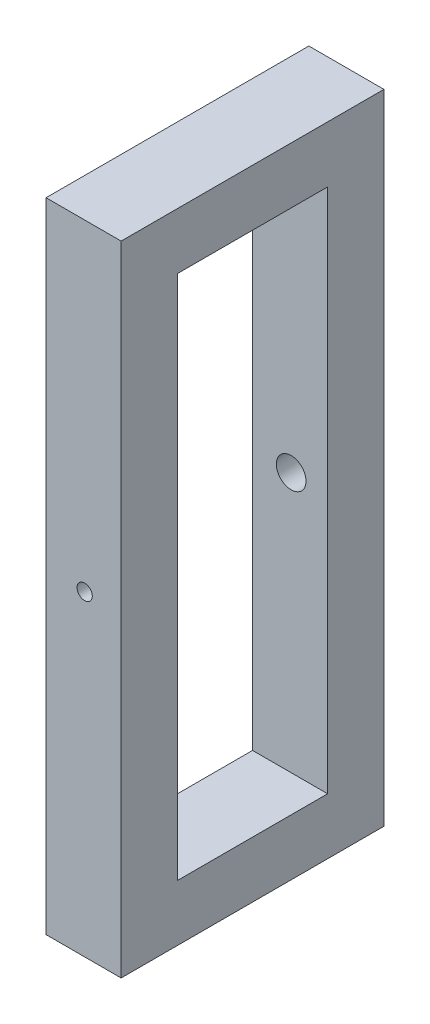
ISO-10303-21;
HEADER;
FILE_DESCRIPTION(('STEP AP214'),'2;1');
FILE_NAME('part.step','',(''),(''),'','','');
FILE_SCHEMA(('AUTOMOTIVE_DESIGN { 1 0 10303 214 1 1 1 1 }'));
ENDSEC;
DATA;
#1=APPLICATION_CONTEXT('core data for automotive mechanical design processes');
#2=APPLICATION_PROTOCOL_DEFINITION('international standard','automotive_design',2000,#1);
#3=PRODUCT_CONTEXT('',#1,'mechanical');
#4=PRODUCT('Part','Part','',(#3));
#5=PRODUCT_RELATED_PRODUCT_CATEGORY('part','',(#4));
#6=PRODUCT_DEFINITION_FORMATION('','',#4);
#7=PRODUCT_DEFINITION_CONTEXT('part definition',#1,'design');
#8=PRODUCT_DEFINITION('design','',#6,#7);
#9=PRODUCT_DEFINITION_SHAPE('','',#8);
#10=(LENGTH_UNIT() NAMED_UNIT(*) SI_UNIT(.MILLI.,.METRE.));
#11=(NAMED_UNIT(*) PLANE_ANGLE_UNIT() SI_UNIT($,.RADIAN.));
#12=(NAMED_UNIT(*) SI_UNIT($,.STERADIAN.) SOLID_ANGLE_UNIT());
#13=UNCERTAINTY_MEASURE_WITH_UNIT(LENGTH_MEASURE(1.E-05),#10,'distance_accuracy_value','');
#14=(GEOMETRIC_REPRESENTATION_CONTEXT(3) GLOBAL_UNCERTAINTY_ASSIGNED_CONTEXT((#13)) GLOBAL_UNIT_ASSIGNED_CONTEXT((#10,
#11,#12)) REPRESENTATION_CONTEXT('',''));
#15=CARTESIAN_POINT('',(0.,0.,0.));
#16=DIRECTION('',(0.,0.,1.));
#17=DIRECTION('',(1.,0.,0.));
#18=AXIS2_PLACEMENT_3D('',#15,#16,#17);
#19=CARTESIAN_POINT('',(20.,0.,0.));
#20=DIRECTION('',(-1.,0.,0.));
#21=DIRECTION('',(0.,0.,1.));
#22=AXIS2_PLACEMENT_3D('',#19,#20,#21);
#23=PLANE('',#22);
#24=DIRECTION('',(0.,1.,0.));
#25=VECTOR('',#24,1.);
#26=CARTESIAN_POINT('',(20.,-85.,-35.));
#27=LINE('',#26,#25);
#28=CARTESIAN_POINT('',(20.,-85.,-35.));
#29=VERTEX_POINT('',#28);
#30=CARTESIAN_POINT('',(20.,85.,-35.));
#31=VERTEX_POINT('',#30);
#32=EDGE_CURVE('E142',#29,#31,#27,.T.);
#33=ORIENTED_EDGE('',*,*,#32,.T.);
#34=DIRECTION('',(0.,0.,1.));
#35=VECTOR('',#34,1.);
#36=CARTESIAN_POINT('',(20.,85.,35.));
#37=LINE('',#36,#35);
#38=CARTESIAN_POINT('',(20.,85.,35.));
#39=VERTEX_POINT('',#38);
#40=EDGE_CURVE('E145',#31,#39,#37,.T.);
#41=ORIENTED_EDGE('',*,*,#40,.T.);
#42=DIRECTION('',(0.,-1.,0.));
#43=VECTOR('',#42,1.);
#44=CARTESIAN_POINT('',(20.,-85.,35.));
#45=LINE('',#44,#43);
#46=CARTESIAN_POINT('',(20.,-85.,35.));
#47=VERTEX_POINT('',#46);
#48=EDGE_CURVE('E148',#39,#47,#45,.T.);
#49=ORIENTED_EDGE('',*,*,#48,.T.);
#50=DIRECTION('',(0.,0.,-1.));
#51=VECTOR('',#50,1.);
#52=CARTESIAN_POINT('',(20.,-85.,35.));
#53=LINE('',#52,#51);
#54=EDGE_CURVE('E150',#47,#29,#53,.T.);
#55=ORIENTED_EDGE('',*,*,#54,.T.);
#56=EDGE_LOOP('',(#33,#41,#49,#55));
#57=FACE_BOUND('',#56,.T.);
#58=DIRECTION('',(0.,1.,0.));
#59=VECTOR('',#58,1.);
#60=CARTESIAN_POINT('',(20.,-70.,-20.));
#61=LINE('',#60,#59);
#62=CARTESIAN_POINT('',(20.,-70.,-20.));
#63=VERTEX_POINT('',#62);
#64=CARTESIAN_POINT('',(20.,70.,-20.));
#65=VERTEX_POINT('',#64);
#66=EDGE_CURVE('E104',#63,#65,#61,.T.);
#67=ORIENTED_EDGE('',*,*,#66,.F.);
#68=DIRECTION('',(0.,0.,-1.));
#69=VECTOR('',#68,1.);
#70=CARTESIAN_POINT('',(20.,-70.,20.));
#71=LINE('',#70,#69);
#72=CARTESIAN_POINT('',(20.,-70.,20.));
#73=VERTEX_POINT('',#72);
#74=EDGE_CURVE('E126',#73,#63,#71,.T.);
#75=ORIENTED_EDGE('',*,*,#74,.F.);
#76=DIRECTION('',(0.,-1.,0.));
#77=VECTOR('',#76,1.);
#78=CARTESIAN_POINT('',(20.,-70.,20.));
#79=LINE('',#78,#77);
#80=CARTESIAN_POINT('',(20.,70.,20.));
#81=VERTEX_POINT('',#80);
#82=EDGE_CURVE('E124',#81,#73,#79,.T.);
#83=ORIENTED_EDGE('',*,*,#82,.F.);
#84=DIRECTION('',(0.,0.,1.));
#85=VECTOR('',#84,1.);
#86=CARTESIAN_POINT('',(20.,70.,20.));
#87=LINE('',#86,#85);
#88=EDGE_CURVE('E112',#65,#81,#87,.T.);
#89=ORIENTED_EDGE('',*,*,#88,.F.);
#90=EDGE_LOOP('',(#67,#75,#83,#89));
#91=FACE_BOUND('',#90,.T.);
#92=ADVANCED_FACE('F38',(#57,#91),#23,.F.);
#93=CARTESIAN_POINT('',(0.,0.,0.));
#94=DIRECTION('',(-1.,0.,0.));
#95=DIRECTION('',(0.,0.,1.));
#96=AXIS2_PLACEMENT_3D('',#93,#94,#95);
#97=PLANE('',#96);
#98=DIRECTION('',(0.,1.,0.));
#99=VECTOR('',#98,1.);
#100=CARTESIAN_POINT('',(0.,-85.,-35.));
#101=LINE('',#100,#99);
#102=CARTESIAN_POINT('',(0.,-85.,-35.));
#103=VERTEX_POINT('',#102);
#104=CARTESIAN_POINT('',(0.,85.,-35.));
#105=VERTEX_POINT('',#104);
#106=EDGE_CURVE('E120',#103,#105,#101,.T.);
#107=ORIENTED_EDGE('',*,*,#106,.F.);
#108=DIRECTION('',(0.,0.,-1.));
#109=VECTOR('',#108,1.);
#110=CARTESIAN_POINT('',(0.,-85.,35.));
#111=LINE('',#110,#109);
#112=CARTESIAN_POINT('',(0.,-85.,35.));
#113=VERTEX_POINT('',#112);
#114=EDGE_CURVE('E146',#113,#103,#111,.T.);
#115=ORIENTED_EDGE('',*,*,#114,.F.);
#116=DIRECTION('',(0.,-1.,0.));
#117=VECTOR('',#116,1.);
#118=CARTESIAN_POINT('',(0.,-85.,35.));
#119=LINE('',#118,#117);
#120=CARTESIAN_POINT('',(0.,85.,35.));
#121=VERTEX_POINT('',#120);
#122=EDGE_CURVE('E157',#121,#113,#119,.T.);
#123=ORIENTED_EDGE('',*,*,#122,.F.);
#124=DIRECTION('',(0.,0.,1.));
#125=VECTOR('',#124,1.);
#126=CARTESIAN_POINT('',(0.,85.,35.));
#127=LINE('',#126,#125);
#128=EDGE_CURVE('E155',#105,#121,#127,.T.);
#129=ORIENTED_EDGE('',*,*,#128,.F.);
#130=EDGE_LOOP('',(#107,#115,#123,#129));
#131=FACE_BOUND('',#130,.T.);
#132=DIRECTION('',(0.,0.,-1.));
#133=VECTOR('',#132,1.);
#134=CARTESIAN_POINT('',(0.,-70.,20.));
#135=LINE('',#134,#133);
#136=CARTESIAN_POINT('',(0.,-70.,20.));
#137=VERTEX_POINT('',#136);
#138=CARTESIAN_POINT('',(0.,-70.,-20.));
#139=VERTEX_POINT('',#138);
#140=EDGE_CURVE('E113',#137,#139,#135,.T.);
#141=ORIENTED_EDGE('',*,*,#140,.T.);
#142=DIRECTION('',(0.,1.,0.));
#143=VECTOR('',#142,1.);
#144=CARTESIAN_POINT('',(0.,-70.,-20.));
#145=LINE('',#144,#143);
#146=CARTESIAN_POINT('',(0.,70.,-20.));
#147=VERTEX_POINT('',#146);
#148=EDGE_CURVE('E62',#139,#147,#145,.T.);
#149=ORIENTED_EDGE('',*,*,#148,.T.);
#150=DIRECTION('',(0.,0.,1.));
#151=VECTOR('',#150,1.);
#152=CARTESIAN_POINT('',(0.,70.,20.));
#153=LINE('',#152,#151);
#154=CARTESIAN_POINT('',(0.,70.,20.));
#155=VERTEX_POINT('',#154);
#156=EDGE_CURVE('E119',#147,#155,#153,.T.);
#157=ORIENTED_EDGE('',*,*,#156,.T.);
#158=DIRECTION('',(0.,-1.,0.));
#159=VECTOR('',#158,1.);
#160=CARTESIAN_POINT('',(0.,-70.,20.));
#161=LINE('',#160,#159);
#162=EDGE_CURVE('E134',#155,#137,#161,.T.);
#163=ORIENTED_EDGE('',*,*,#162,.T.);
#164=EDGE_LOOP('',(#141,#149,#157,#163));
#165=FACE_BOUND('',#164,.T.);
#166=ADVANCED_FACE('F176',(#131,#165),#97,.T.);
#167=CARTESIAN_POINT('',(20.,-85.,-35.));
#168=DIRECTION('',(0.,0.,1.));
#169=DIRECTION('',(1.,0.,0.));
#170=AXIS2_PLACEMENT_3D('',#167,#168,#169);
#171=PLANE('',#170);
#172=CARTESIAN_POINT('',(10.287047221847,-0.78442691867181,-35.));
#173=DIRECTION('',(0.,0.,1.));
#174=DIRECTION('',(1.,0.,0.));
#175=AXIS2_PLACEMENT_3D('',#172,#173,#174);
#176=CIRCLE('',#175,4.47618845762379);
#177=CARTESIAN_POINT('',(14.7632356794708,-0.78442691867181,-35.));
#178=VERTEX_POINT('',#177);
#179=EDGE_CURVE('E132',#178,#178,#176,.T.);
#180=ORIENTED_EDGE('',*,*,#179,.T.);
#181=EDGE_LOOP('',(#180));
#182=FACE_BOUND('',#181,.T.);
#183=ORIENTED_EDGE('',*,*,#106,.T.);
#184=DIRECTION('',(-1.,0.,0.));
#185=VECTOR('',#184,1.);
#186=CARTESIAN_POINT('',(20.,85.,-35.));
#187=LINE('',#186,#185);
#188=EDGE_CURVE('E11',#31,#105,#187,.T.);
#189=ORIENTED_EDGE('',*,*,#188,.F.);
#190=ORIENTED_EDGE('',*,*,#32,.F.);
#191=DIRECTION('',(-1.,0.,0.));
#192=VECTOR('',#191,1.);
#193=CARTESIAN_POINT('',(20.,-85.,-35.));
#194=LINE('',#193,#192);
#195=EDGE_CURVE('E152',#29,#103,#194,.T.);
#196=ORIENTED_EDGE('',*,*,#195,.T.);
#197=EDGE_LOOP('',(#183,#189,#190,#196));
#198=FACE_BOUND('',#197,.T.);
#199=ADVANCED_FACE('F40',(#182,#198),#171,.F.);
#200=CARTESIAN_POINT('',(20.,85.,35.));
#201=DIRECTION('',(0.,-1.,0.));
#202=DIRECTION('',(0.,0.,-1.));
#203=AXIS2_PLACEMENT_3D('',#200,#201,#202);
#204=PLANE('',#203);
#205=ORIENTED_EDGE('',*,*,#128,.T.);
#206=DIRECTION('',(-1.,0.,0.));
#207=VECTOR('',#206,1.);
#208=CARTESIAN_POINT('',(20.,85.,35.));
#209=LINE('',#208,#207);
#210=EDGE_CURVE('E47',#39,#121,#209,.T.);
#211=ORIENTED_EDGE('',*,*,#210,.F.);
#212=ORIENTED_EDGE('',*,*,#40,.F.);
#213=ORIENTED_EDGE('',*,*,#188,.T.);
#214=EDGE_LOOP('',(#205,#211,#212,#213));
#215=FACE_BOUND('',#214,.T.);
#216=ADVANCED_FACE('F186',(#215),#204,.F.);
#217=CARTESIAN_POINT('',(20.,-85.,35.));
#218=DIRECTION('',(0.,0.,-1.));
#219=DIRECTION('',(-1.,0.,0.));
#220=AXIS2_PLACEMENT_3D('',#217,#218,#219);
#221=PLANE('',#220);
#222=CARTESIAN_POINT('',(10.287047221847,-0.78442691867181,35.));
#223=DIRECTION('',(0.,0.,-1.));
#224=DIRECTION('',(-1.,0.,0.));
#225=AXIS2_PLACEMENT_3D('',#222,#223,#224);
#226=CIRCLE('',#225,2.03173459320144);
#227=CARTESIAN_POINT('',(8.25531262864559,-0.78442691867181,35.));
#228=VERTEX_POINT('',#227);
#229=EDGE_CURVE('E223',#228,#228,#226,.T.);
#230=ORIENTED_EDGE('',*,*,#229,.T.);
#231=EDGE_LOOP('',(#230));
#232=FACE_BOUND('',#231,.T.);
#233=ORIENTED_EDGE('',*,*,#122,.T.);
#234=DIRECTION('',(-1.,0.,0.));
#235=VECTOR('',#234,1.);
#236=CARTESIAN_POINT('',(20.,-85.,35.));
#237=LINE('',#236,#235);
#238=EDGE_CURVE('E162',#47,#113,#237,.T.);
#239=ORIENTED_EDGE('',*,*,#238,.F.);
#240=ORIENTED_EDGE('',*,*,#48,.F.);
#241=ORIENTED_EDGE('',*,*,#210,.T.);
#242=EDGE_LOOP('',(#233,#239,#240,#241));
#243=FACE_BOUND('',#242,.T.);
#244=ADVANCED_FACE('F170',(#232,#243),#221,.F.);
#245=CARTESIAN_POINT('',(20.,-85.,35.));
#246=DIRECTION('',(0.,1.,0.));
#247=DIRECTION('',(0.,0.,1.));
#248=AXIS2_PLACEMENT_3D('',#245,#246,#247);
#249=PLANE('',#248);
#250=ORIENTED_EDGE('',*,*,#114,.T.);
#251=ORIENTED_EDGE('',*,*,#195,.F.);
#252=ORIENTED_EDGE('',*,*,#54,.F.);
#253=ORIENTED_EDGE('',*,*,#238,.T.);
#254=EDGE_LOOP('',(#250,#251,#252,#253));
#255=FACE_BOUND('',#254,.T.);
#256=ADVANCED_FACE('F180',(#255),#249,.F.);
#257=CARTESIAN_POINT('',(20.,-70.,-20.));
#258=DIRECTION('',(0.,0.,1.));
#259=DIRECTION('',(1.,0.,0.));
#260=AXIS2_PLACEMENT_3D('',#257,#258,#259);
#261=PLANE('',#260);
#262=CARTESIAN_POINT('',(10.287047221847,-0.78442691867181,-20.));
#263=DIRECTION('',(0.,0.,1.));
#264=DIRECTION('',(1.,0.,0.));
#265=AXIS2_PLACEMENT_3D('',#262,#263,#264);
#266=CIRCLE('',#265,3.95237691524757);
#267=CARTESIAN_POINT('',(14.2394241370946,-0.78442691867181,-20.));
#268=VERTEX_POINT('',#267);
#269=EDGE_CURVE('E218',#268,#268,#266,.T.);
#270=ORIENTED_EDGE('',*,*,#269,.F.);
#271=EDGE_LOOP('',(#270));
#272=FACE_BOUND('',#271,.T.);
#273=ORIENTED_EDGE('',*,*,#148,.F.);
#274=DIRECTION('',(-1.,0.,0.));
#275=VECTOR('',#274,1.);
#276=CARTESIAN_POINT('',(20.,-70.,-20.));
#277=LINE('',#276,#275);
#278=EDGE_CURVE('E108',#63,#139,#277,.T.);
#279=ORIENTED_EDGE('',*,*,#278,.F.);
#280=ORIENTED_EDGE('',*,*,#66,.T.);
#281=DIRECTION('',(-1.,0.,0.));
#282=VECTOR('',#281,1.);
#283=CARTESIAN_POINT('',(20.,70.,-20.));
#284=LINE('',#283,#282);
#285=EDGE_CURVE('E107',#65,#147,#284,.T.);
#286=ORIENTED_EDGE('',*,*,#285,.T.);
#287=EDGE_LOOP('',(#273,#279,#280,#286));
#288=FACE_BOUND('',#287,.T.);
#289=ADVANCED_FACE('F106',(#272,#288),#261,.T.);
#290=CARTESIAN_POINT('',(20.,70.,20.));
#291=DIRECTION('',(0.,-1.,0.));
#292=DIRECTION('',(0.,0.,-1.));
#293=AXIS2_PLACEMENT_3D('',#290,#291,#292);
#294=PLANE('',#293);
#295=ORIENTED_EDGE('',*,*,#156,.F.);
#296=ORIENTED_EDGE('',*,*,#285,.F.);
#297=ORIENTED_EDGE('',*,*,#88,.T.);
#298=DIRECTION('',(-1.,0.,0.));
#299=VECTOR('',#298,1.);
#300=CARTESIAN_POINT('',(20.,70.,20.));
#301=LINE('',#300,#299);
#302=EDGE_CURVE('E121',#81,#155,#301,.T.);
#303=ORIENTED_EDGE('',*,*,#302,.T.);
#304=EDGE_LOOP('',(#295,#296,#297,#303));
#305=FACE_BOUND('',#304,.T.);
#306=ADVANCED_FACE('F116',(#305),#294,.T.);
#307=CARTESIAN_POINT('',(20.,-70.,20.));
#308=DIRECTION('',(0.,0.,-1.));
#309=DIRECTION('',(-1.,0.,0.));
#310=AXIS2_PLACEMENT_3D('',#307,#308,#309);
#311=PLANE('',#310);
#312=CARTESIAN_POINT('',(10.287047221847,-0.78442691867181,20.));
#313=DIRECTION('',(0.,0.,-1.));
#314=DIRECTION('',(-1.,0.,0.));
#315=AXIS2_PLACEMENT_3D('',#312,#313,#314);
#316=CIRCLE('',#315,2.55554613557766);
#317=CARTESIAN_POINT('',(7.73150108626938,-0.78442691867181,20.));
#318=VERTEX_POINT('',#317);
#319=EDGE_CURVE('E42',#318,#318,#316,.T.);
#320=ORIENTED_EDGE('',*,*,#319,.F.);
#321=EDGE_LOOP('',(#320));
#322=FACE_BOUND('',#321,.T.);
#323=ORIENTED_EDGE('',*,*,#162,.F.);
#324=ORIENTED_EDGE('',*,*,#302,.F.);
#325=ORIENTED_EDGE('',*,*,#82,.T.);
#326=DIRECTION('',(-1.,0.,0.));
#327=VECTOR('',#326,1.);
#328=CARTESIAN_POINT('',(20.,-70.,20.));
#329=LINE('',#328,#327);
#330=EDGE_CURVE('E54',#73,#137,#329,.T.);
#331=ORIENTED_EDGE('',*,*,#330,.T.);
#332=EDGE_LOOP('',(#323,#324,#325,#331));
#333=FACE_BOUND('',#332,.T.);
#334=ADVANCED_FACE('F215',(#322,#333),#311,.T.);
#335=CARTESIAN_POINT('',(20.,-70.,20.));
#336=DIRECTION('',(0.,1.,0.));
#337=DIRECTION('',(0.,0.,1.));
#338=AXIS2_PLACEMENT_3D('',#335,#336,#337);
#339=PLANE('',#338);
#340=ORIENTED_EDGE('',*,*,#140,.F.);
#341=ORIENTED_EDGE('',*,*,#330,.F.);
#342=ORIENTED_EDGE('',*,*,#74,.T.);
#343=ORIENTED_EDGE('',*,*,#278,.T.);
#344=EDGE_LOOP('',(#340,#341,#342,#343));
#345=FACE_BOUND('',#344,.T.);
#346=ADVANCED_FACE('F231',(#345),#339,.T.);
#347=CARTESIAN_POINT('',(10.287047221847,-0.78442691867181,-50.));
#348=DIRECTION('',(0.,0.,-1.));
#349=DIRECTION('',(-1.,0.,0.));
#350=AXIS2_PLACEMENT_3D('',#347,#348,#349);
#351=CONICAL_SURFACE('',#350,5.,0.0349065850398867);
#352=ORIENTED_EDGE('',*,*,#319,.T.);
#353=EDGE_LOOP('',(#352));
#354=FACE_BOUND('',#353,.T.);
#355=ORIENTED_EDGE('',*,*,#229,.F.);
#356=EDGE_LOOP('',(#355));
#357=FACE_BOUND('',#356,.T.);
#358=ADVANCED_FACE('F228',(#354,#357),#351,.F.);
#359=ORIENTED_EDGE('',*,*,#269,.T.);
#360=EDGE_LOOP('',(#359));
#361=FACE_BOUND('',#360,.T.);
#362=ORIENTED_EDGE('',*,*,#179,.F.);
#363=EDGE_LOOP('',(#362));
#364=FACE_BOUND('',#363,.T.);
#365=ADVANCED_FACE('F230',(#361,#364),#351,.F.);
#366=CLOSED_SHELL('',(#92,#166,#199,#216,#244,#256,#289,#306,#334,#346,#358,#365));
#367=MANIFOLD_SOLID_BREP('B2',#366);
#368=ADVANCED_BREP_SHAPE_REPRESENTATION('',(#18,#367),#14);
#369=SHAPE_DEFINITION_REPRESENTATION(#9,#368);
ENDSEC;
END-ISO-10303-21;
